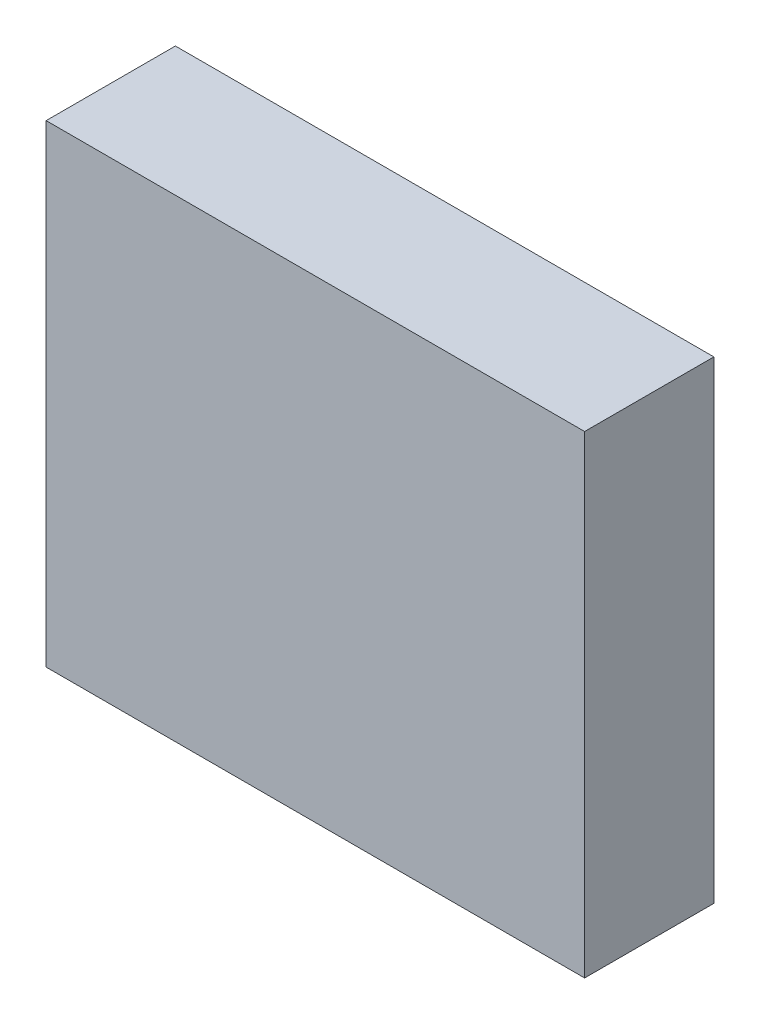
ISO-10303-21;
HEADER;
FILE_DESCRIPTION(('STEP AP214'),'2;1');
FILE_NAME('part.step','',(''),(''),'','','');
FILE_SCHEMA(('AUTOMOTIVE_DESIGN { 1 0 10303 214 1 1 1 1 }'));
ENDSEC;
DATA;
#1=APPLICATION_CONTEXT('core data for automotive mechanical design processes');
#2=APPLICATION_PROTOCOL_DEFINITION('international standard','automotive_design',2000,#1);
#3=PRODUCT_CONTEXT('',#1,'mechanical');
#4=PRODUCT('Part','Part','',(#3));
#5=PRODUCT_RELATED_PRODUCT_CATEGORY('part','',(#4));
#6=PRODUCT_DEFINITION_FORMATION('','',#4);
#7=PRODUCT_DEFINITION_CONTEXT('part definition',#1,'design');
#8=PRODUCT_DEFINITION('design','',#6,#7);
#9=PRODUCT_DEFINITION_SHAPE('','',#8);
#10=(LENGTH_UNIT() NAMED_UNIT(*) SI_UNIT(.MILLI.,.METRE.));
#11=(NAMED_UNIT(*) PLANE_ANGLE_UNIT() SI_UNIT($,.RADIAN.));
#12=(NAMED_UNIT(*) SI_UNIT($,.STERADIAN.) SOLID_ANGLE_UNIT());
#13=UNCERTAINTY_MEASURE_WITH_UNIT(LENGTH_MEASURE(1.E-05),#10,'distance_accuracy_value','');
#14=(GEOMETRIC_REPRESENTATION_CONTEXT(3) GLOBAL_UNCERTAINTY_ASSIGNED_CONTEXT((#13)) GLOBAL_UNIT_ASSIGNED_CONTEXT((#10,
#11,#12)) REPRESENTATION_CONTEXT('',''));
#15=CARTESIAN_POINT('',(0.,0.,0.));
#16=DIRECTION('',(0.,0.,1.));
#17=DIRECTION('',(1.,0.,0.));
#18=AXIS2_PLACEMENT_3D('',#15,#16,#17);
#19=CARTESIAN_POINT('',(-2.266594,-1.675,1.));
#20=DIRECTION('',(1.,0.,0.));
#21=DIRECTION('',(0.,0.,-1.));
#22=AXIS2_PLACEMENT_3D('',#19,#20,#21);
#23=PLANE('',#22);
#24=DIRECTION('',(0.,-1.,0.));
#25=VECTOR('',#24,1.);
#26=CARTESIAN_POINT('',(-2.266594,-1.675,0.));
#27=LINE('',#26,#25);
#28=CARTESIAN_POINT('',(-2.266594,1.987194,0.));
#29=VERTEX_POINT('',#28);
#30=CARTESIAN_POINT('',(-2.266594,-1.675,0.));
#31=VERTEX_POINT('',#30);
#32=EDGE_CURVE('E95',#29,#31,#27,.T.);
#33=ORIENTED_EDGE('',*,*,#32,.T.);
#34=DIRECTION('',(0.,0.,-1.));
#35=VECTOR('',#34,1.);
#36=CARTESIAN_POINT('',(-2.266594,-1.675,1.));
#37=LINE('',#36,#35);
#38=CARTESIAN_POINT('',(-2.266594,-1.675,1.));
#39=VERTEX_POINT('',#38);
#40=EDGE_CURVE('E11',#39,#31,#37,.T.);
#41=ORIENTED_EDGE('',*,*,#40,.F.);
#42=DIRECTION('',(0.,-1.,0.));
#43=VECTOR('',#42,1.);
#44=CARTESIAN_POINT('',(-2.266594,-1.675,1.));
#45=LINE('',#44,#43);
#46=CARTESIAN_POINT('',(-2.266594,1.987194,1.));
#47=VERTEX_POINT('',#46);
#48=EDGE_CURVE('E83',#47,#39,#45,.T.);
#49=ORIENTED_EDGE('',*,*,#48,.F.);
#50=DIRECTION('',(0.,0.,-1.));
#51=VECTOR('',#50,1.);
#52=CARTESIAN_POINT('',(-2.266594,1.987194,1.));
#53=LINE('',#52,#51);
#54=EDGE_CURVE('E91',#47,#29,#53,.T.);
#55=ORIENTED_EDGE('',*,*,#54,.T.);
#56=EDGE_LOOP('',(#33,#41,#49,#55));
#57=FACE_BOUND('',#56,.T.);
#58=ADVANCED_FACE('F32',(#57),#23,.F.);
#59=CARTESIAN_POINT('',(1.9,-1.675,1.));
#60=DIRECTION('',(0.,1.,0.));
#61=DIRECTION('',(0.,0.,1.));
#62=AXIS2_PLACEMENT_3D('',#59,#60,#61);
#63=PLANE('',#62);
#64=DIRECTION('',(1.,0.,0.));
#65=VECTOR('',#64,1.);
#66=CARTESIAN_POINT('',(1.9,-1.675,0.));
#67=LINE('',#66,#65);
#68=CARTESIAN_POINT('',(1.9,-1.675,0.));
#69=VERTEX_POINT('',#68);
#70=EDGE_CURVE('E87',#31,#69,#67,.T.);
#71=ORIENTED_EDGE('',*,*,#70,.T.);
#72=DIRECTION('',(0.,0.,-1.));
#73=VECTOR('',#72,1.);
#74=CARTESIAN_POINT('',(1.9,-1.675,1.));
#75=LINE('',#74,#73);
#76=CARTESIAN_POINT('',(1.9,-1.675,1.));
#77=VERTEX_POINT('',#76);
#78=EDGE_CURVE('E40',#77,#69,#75,.T.);
#79=ORIENTED_EDGE('',*,*,#78,.F.);
#80=DIRECTION('',(1.,0.,0.));
#81=VECTOR('',#80,1.);
#82=CARTESIAN_POINT('',(1.9,-1.675,1.));
#83=LINE('',#82,#81);
#84=EDGE_CURVE('E78',#39,#77,#83,.T.);
#85=ORIENTED_EDGE('',*,*,#84,.F.);
#86=ORIENTED_EDGE('',*,*,#40,.T.);
#87=EDGE_LOOP('',(#71,#79,#85,#86));
#88=FACE_BOUND('',#87,.T.);
#89=ADVANCED_FACE('F86',(#88),#63,.F.);
#90=CARTESIAN_POINT('',(1.9,1.987194,1.));
#91=DIRECTION('',(-1.,0.,0.));
#92=DIRECTION('',(0.,0.,1.));
#93=AXIS2_PLACEMENT_3D('',#90,#91,#92);
#94=PLANE('',#93);
#95=DIRECTION('',(0.,1.,0.));
#96=VECTOR('',#95,1.);
#97=CARTESIAN_POINT('',(1.9,1.987194,0.));
#98=LINE('',#97,#96);
#99=CARTESIAN_POINT('',(1.9,1.987194,0.));
#100=VERTEX_POINT('',#99);
#101=EDGE_CURVE('E65',#69,#100,#98,.T.);
#102=ORIENTED_EDGE('',*,*,#101,.T.);
#103=DIRECTION('',(0.,0.,-1.));
#104=VECTOR('',#103,1.);
#105=CARTESIAN_POINT('',(1.9,1.987194,1.));
#106=LINE('',#105,#104);
#107=CARTESIAN_POINT('',(1.9,1.987194,1.));
#108=VERTEX_POINT('',#107);
#109=EDGE_CURVE('E88',#108,#100,#106,.T.);
#110=ORIENTED_EDGE('',*,*,#109,.F.);
#111=DIRECTION('',(0.,1.,0.));
#112=VECTOR('',#111,1.);
#113=CARTESIAN_POINT('',(1.9,1.987194,1.));
#114=LINE('',#113,#112);
#115=EDGE_CURVE('E81',#77,#108,#114,.T.);
#116=ORIENTED_EDGE('',*,*,#115,.F.);
#117=ORIENTED_EDGE('',*,*,#78,.T.);
#118=EDGE_LOOP('',(#102,#110,#116,#117));
#119=FACE_BOUND('',#118,.T.);
#120=ADVANCED_FACE('F89',(#119),#94,.F.);
#121=CARTESIAN_POINT('',(-2.266594,1.987194,1.));
#122=DIRECTION('',(0.,-1.,0.));
#123=DIRECTION('',(0.,0.,-1.));
#124=AXIS2_PLACEMENT_3D('',#121,#122,#123);
#125=PLANE('',#124);
#126=DIRECTION('',(-1.,0.,0.));
#127=VECTOR('',#126,1.);
#128=CARTESIAN_POINT('',(-2.266594,1.987194,0.));
#129=LINE('',#128,#127);
#130=EDGE_CURVE('E71',#100,#29,#129,.T.);
#131=ORIENTED_EDGE('',*,*,#130,.T.);
#132=ORIENTED_EDGE('',*,*,#54,.F.);
#133=DIRECTION('',(-1.,0.,0.));
#134=VECTOR('',#133,1.);
#135=CARTESIAN_POINT('',(-2.266594,1.987194,1.));
#136=LINE('',#135,#134);
#137=EDGE_CURVE('E48',#108,#47,#136,.T.);
#138=ORIENTED_EDGE('',*,*,#137,.F.);
#139=ORIENTED_EDGE('',*,*,#109,.T.);
#140=EDGE_LOOP('',(#131,#132,#138,#139));
#141=FACE_BOUND('',#140,.T.);
#142=ADVANCED_FACE('F102',(#141),#125,.F.);
#143=CARTESIAN_POINT('',(0.,0.,1.));
#144=DIRECTION('',(0.,0.,-1.));
#145=DIRECTION('',(-1.,0.,0.));
#146=AXIS2_PLACEMENT_3D('',#143,#144,#145);
#147=PLANE('',#146);
#148=ORIENTED_EDGE('',*,*,#48,.T.);
#149=ORIENTED_EDGE('',*,*,#84,.T.);
#150=ORIENTED_EDGE('',*,*,#115,.T.);
#151=ORIENTED_EDGE('',*,*,#137,.T.);
#152=EDGE_LOOP('',(#148,#149,#150,#151));
#153=FACE_BOUND('',#152,.T.);
#154=ADVANCED_FACE('F79',(#153),#147,.F.);
#155=CARTESIAN_POINT('',(0.,0.,0.));
#156=DIRECTION('',(0.,0.,-1.));
#157=DIRECTION('',(-1.,0.,0.));
#158=AXIS2_PLACEMENT_3D('',#155,#156,#157);
#159=PLANE('',#158);
#160=ORIENTED_EDGE('',*,*,#32,.F.);
#161=ORIENTED_EDGE('',*,*,#130,.F.);
#162=ORIENTED_EDGE('',*,*,#101,.F.);
#163=ORIENTED_EDGE('',*,*,#70,.F.);
#164=EDGE_LOOP('',(#160,#161,#162,#163));
#165=FACE_BOUND('',#164,.T.);
#166=ADVANCED_FACE('F105',(#165),#159,.T.);
#167=CLOSED_SHELL('',(#58,#89,#120,#142,#154,#166));
#168=MANIFOLD_SOLID_BREP('B2',#167);
#169=ADVANCED_BREP_SHAPE_REPRESENTATION('',(#18,#168),#14);
#170=SHAPE_DEFINITION_REPRESENTATION(#9,#169);
ENDSEC;
END-ISO-10303-21;
